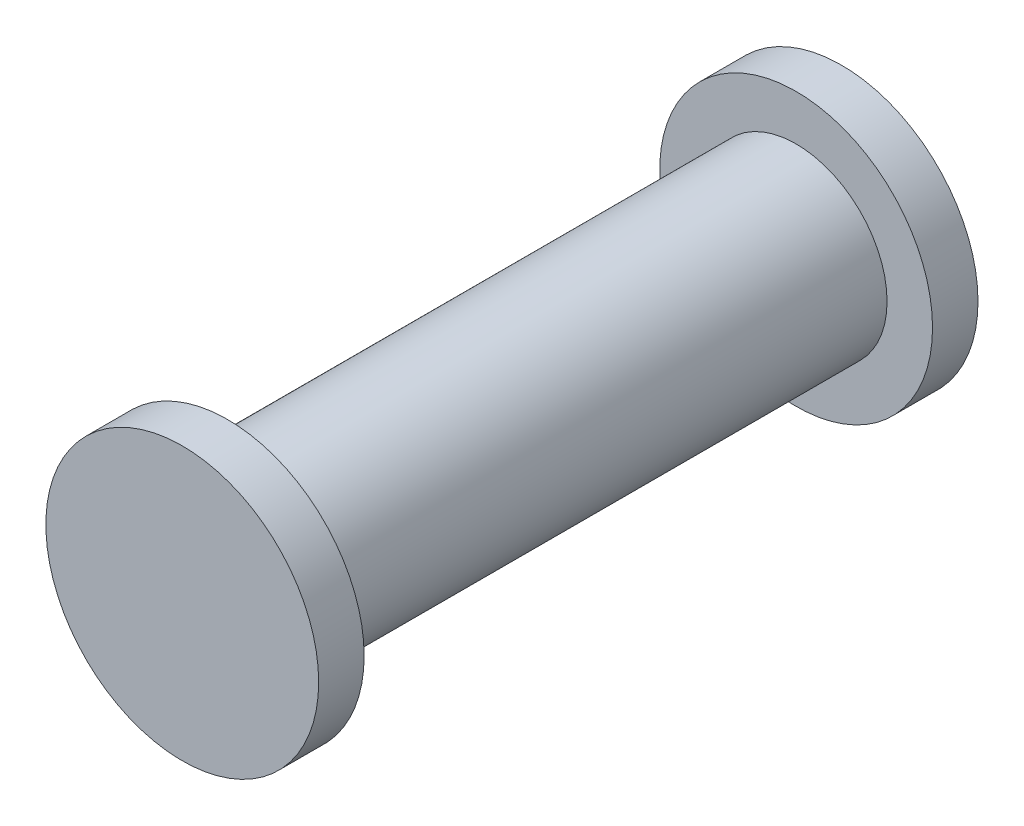
ISO-10303-21;
HEADER;
FILE_DESCRIPTION(('STEP AP214'),'2;1');
FILE_NAME('part.step','',(''),(''),'','','');
FILE_SCHEMA(('AUTOMOTIVE_DESIGN { 1 0 10303 214 1 1 1 1 }'));
ENDSEC;
DATA;
#1=APPLICATION_CONTEXT('core data for automotive mechanical design processes');
#2=APPLICATION_PROTOCOL_DEFINITION('international standard','automotive_design',2000,#1);
#3=PRODUCT_CONTEXT('',#1,'mechanical');
#4=PRODUCT('Part','Part','',(#3));
#5=PRODUCT_RELATED_PRODUCT_CATEGORY('part','',(#4));
#6=PRODUCT_DEFINITION_FORMATION('','',#4);
#7=PRODUCT_DEFINITION_CONTEXT('part definition',#1,'design');
#8=PRODUCT_DEFINITION('design','',#6,#7);
#9=PRODUCT_DEFINITION_SHAPE('','',#8);
#10=(LENGTH_UNIT() NAMED_UNIT(*) SI_UNIT(.MILLI.,.METRE.));
#11=(NAMED_UNIT(*) PLANE_ANGLE_UNIT() SI_UNIT($,.RADIAN.));
#12=(NAMED_UNIT(*) SI_UNIT($,.STERADIAN.) SOLID_ANGLE_UNIT());
#13=UNCERTAINTY_MEASURE_WITH_UNIT(LENGTH_MEASURE(1.E-05),#10,'distance_accuracy_value','');
#14=(GEOMETRIC_REPRESENTATION_CONTEXT(3) GLOBAL_UNCERTAINTY_ASSIGNED_CONTEXT((#13)) GLOBAL_UNIT_ASSIGNED_CONTEXT((#10,
#11,#12)) REPRESENTATION_CONTEXT('',''));
#15=CARTESIAN_POINT('',(0.,0.,0.));
#16=DIRECTION('',(0.,0.,1.));
#17=DIRECTION('',(1.,0.,0.));
#18=AXIS2_PLACEMENT_3D('',#15,#16,#17);
#19=CARTESIAN_POINT('',(0.,0.,12.5));
#20=DIRECTION('',(0.,0.,-1.));
#21=DIRECTION('',(-1.,0.,0.));
#22=AXIS2_PLACEMENT_3D('',#19,#20,#21);
#23=CYLINDRICAL_SURFACE('',#22,4.);
#24=CARTESIAN_POINT('',(0.,0.,12.5));
#25=DIRECTION('',(0.,0.,1.));
#26=DIRECTION('',(1.,0.,0.));
#27=AXIS2_PLACEMENT_3D('',#24,#25,#26);
#28=CIRCLE('',#27,4.);
#29=CARTESIAN_POINT('',(4.,0.,12.5));
#30=VERTEX_POINT('',#29);
#31=EDGE_CURVE('E10',#30,#30,#28,.T.);
#32=ORIENTED_EDGE('',*,*,#31,.F.);
#33=EDGE_LOOP('',(#32));
#34=FACE_BOUND('',#33,.T.);
#35=CARTESIAN_POINT('',(0.,0.,-12.5));
#36=DIRECTION('',(0.,0.,1.));
#37=DIRECTION('',(1.,0.,0.));
#38=AXIS2_PLACEMENT_3D('',#35,#36,#37);
#39=CIRCLE('',#38,4.);
#40=CARTESIAN_POINT('',(4.,0.,-12.5));
#41=VERTEX_POINT('',#40);
#42=EDGE_CURVE('E38',#41,#41,#39,.T.);
#43=ORIENTED_EDGE('',*,*,#42,.T.);
#44=EDGE_LOOP('',(#43));
#45=FACE_BOUND('',#44,.T.);
#46=ADVANCED_FACE('F35',(#34,#45),#23,.T.);
#47=CARTESIAN_POINT('',(0.,0.,14.5));
#48=DIRECTION('',(0.,0.,-1.));
#49=DIRECTION('',(-1.,0.,0.));
#50=AXIS2_PLACEMENT_3D('',#47,#48,#49);
#51=CYLINDRICAL_SURFACE('',#50,6.);
#52=CARTESIAN_POINT('',(0.,0.,14.5));
#53=DIRECTION('',(0.,0.,1.));
#54=DIRECTION('',(1.,0.,0.));
#55=AXIS2_PLACEMENT_3D('',#52,#53,#54);
#56=CIRCLE('',#55,6.);
#57=CARTESIAN_POINT('',(6.,0.,14.5));
#58=VERTEX_POINT('',#57);
#59=EDGE_CURVE('E42',#58,#58,#56,.T.);
#60=ORIENTED_EDGE('',*,*,#59,.F.);
#61=EDGE_LOOP('',(#60));
#62=FACE_BOUND('',#61,.T.);
#63=CARTESIAN_POINT('',(0.,0.,12.5));
#64=DIRECTION('',(0.,0.,1.));
#65=DIRECTION('',(1.,0.,0.));
#66=AXIS2_PLACEMENT_3D('',#63,#64,#65);
#67=CIRCLE('',#66,6.);
#68=CARTESIAN_POINT('',(6.,0.,12.5));
#69=VERTEX_POINT('',#68);
#70=EDGE_CURVE('E46',#69,#69,#67,.T.);
#71=ORIENTED_EDGE('',*,*,#70,.T.);
#72=EDGE_LOOP('',(#71));
#73=FACE_BOUND('',#72,.T.);
#74=ADVANCED_FACE('F83',(#62,#73),#51,.T.);
#75=CARTESIAN_POINT('',(0.,0.,14.5));
#76=DIRECTION('',(0.,0.,1.));
#77=DIRECTION('',(1.,0.,0.));
#78=AXIS2_PLACEMENT_3D('',#75,#76,#77);
#79=PLANE('',#78);
#80=ORIENTED_EDGE('',*,*,#59,.T.);
#81=EDGE_LOOP('',(#80));
#82=FACE_BOUND('',#81,.T.);
#83=ADVANCED_FACE('F79',(#82),#79,.T.);
#84=CARTESIAN_POINT('',(0.,0.,12.5));
#85=DIRECTION('',(0.,0.,1.));
#86=DIRECTION('',(1.,0.,0.));
#87=AXIS2_PLACEMENT_3D('',#84,#85,#86);
#88=PLANE('',#87);
#89=ORIENTED_EDGE('',*,*,#31,.T.);
#90=EDGE_LOOP('',(#89));
#91=FACE_BOUND('',#90,.T.);
#92=ORIENTED_EDGE('',*,*,#70,.F.);
#93=EDGE_LOOP('',(#92));
#94=FACE_BOUND('',#93,.T.);
#95=ADVANCED_FACE('F71',(#91,#94),#88,.F.);
#96=CARTESIAN_POINT('',(0.,0.,-14.5));
#97=DIRECTION('',(0.,0.,1.));
#98=DIRECTION('',(1.,0.,0.));
#99=AXIS2_PLACEMENT_3D('',#96,#97,#98);
#100=CYLINDRICAL_SURFACE('',#99,6.);
#101=CARTESIAN_POINT('',(0.,0.,-14.5));
#102=DIRECTION('',(0.,0.,1.));
#103=DIRECTION('',(1.,0.,0.));
#104=AXIS2_PLACEMENT_3D('',#101,#102,#103);
#105=CIRCLE('',#104,6.);
#106=CARTESIAN_POINT('',(6.,0.,-14.5));
#107=VERTEX_POINT('',#106);
#108=EDGE_CURVE('E54',#107,#107,#105,.T.);
#109=ORIENTED_EDGE('',*,*,#108,.T.);
#110=EDGE_LOOP('',(#109));
#111=FACE_BOUND('',#110,.T.);
#112=CARTESIAN_POINT('',(0.,0.,-12.5));
#113=DIRECTION('',(0.,0.,1.));
#114=DIRECTION('',(1.,0.,0.));
#115=AXIS2_PLACEMENT_3D('',#112,#113,#114);
#116=CIRCLE('',#115,6.);
#117=CARTESIAN_POINT('',(6.,0.,-12.5));
#118=VERTEX_POINT('',#117);
#119=EDGE_CURVE('E51',#118,#118,#116,.T.);
#120=ORIENTED_EDGE('',*,*,#119,.F.);
#121=EDGE_LOOP('',(#120));
#122=FACE_BOUND('',#121,.T.);
#123=ADVANCED_FACE('F69',(#111,#122),#100,.T.);
#124=CARTESIAN_POINT('',(0.,0.,-14.5));
#125=DIRECTION('',(0.,0.,-1.));
#126=DIRECTION('',(1.,0.,0.));
#127=AXIS2_PLACEMENT_3D('',#124,#125,#126);
#128=PLANE('',#127);
#129=ORIENTED_EDGE('',*,*,#108,.F.);
#130=EDGE_LOOP('',(#129));
#131=FACE_BOUND('',#130,.T.);
#132=ADVANCED_FACE('F65',(#131),#128,.T.);
#133=CARTESIAN_POINT('',(0.,0.,-12.5));
#134=DIRECTION('',(0.,0.,-1.));
#135=DIRECTION('',(1.,0.,0.));
#136=AXIS2_PLACEMENT_3D('',#133,#134,#135);
#137=PLANE('',#136);
#138=ORIENTED_EDGE('',*,*,#42,.F.);
#139=EDGE_LOOP('',(#138));
#140=FACE_BOUND('',#139,.T.);
#141=ORIENTED_EDGE('',*,*,#119,.T.);
#142=EDGE_LOOP('',(#141));
#143=FACE_BOUND('',#142,.T.);
#144=ADVANCED_FACE('F62',(#140,#143),#137,.F.);
#145=CLOSED_SHELL('',(#46,#74,#83,#95,#123,#132,#144));
#146=MANIFOLD_SOLID_BREP('B2',#145);
#147=ADVANCED_BREP_SHAPE_REPRESENTATION('',(#18,#146),#14);
#148=SHAPE_DEFINITION_REPRESENTATION(#9,#147);
ENDSEC;
END-ISO-10303-21;
